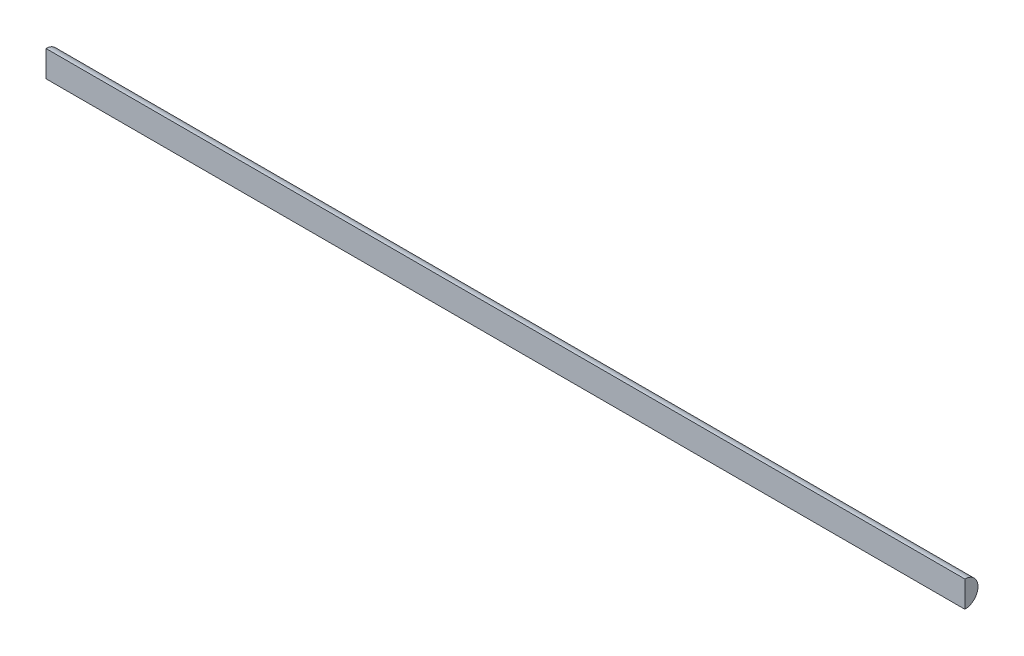
ISO-10303-21;
HEADER;
FILE_DESCRIPTION(('STEP AP214'),'2;1');
FILE_NAME('part.step','',(''),(''),'','','');
FILE_SCHEMA(('AUTOMOTIVE_DESIGN { 1 0 10303 214 1 1 1 1 }'));
ENDSEC;
DATA;
#1=APPLICATION_CONTEXT('core data for automotive mechanical design processes');
#2=APPLICATION_PROTOCOL_DEFINITION('international standard','automotive_design',2000,#1);
#3=PRODUCT_CONTEXT('',#1,'mechanical');
#4=PRODUCT('Part','Part','',(#3));
#5=PRODUCT_RELATED_PRODUCT_CATEGORY('part','',(#4));
#6=PRODUCT_DEFINITION_FORMATION('','',#4);
#7=PRODUCT_DEFINITION_CONTEXT('part definition',#1,'design');
#8=PRODUCT_DEFINITION('design','',#6,#7);
#9=PRODUCT_DEFINITION_SHAPE('','',#8);
#10=(LENGTH_UNIT() NAMED_UNIT(*) SI_UNIT(.MILLI.,.METRE.));
#11=(NAMED_UNIT(*) PLANE_ANGLE_UNIT() SI_UNIT($,.RADIAN.));
#12=(NAMED_UNIT(*) SI_UNIT($,.STERADIAN.) SOLID_ANGLE_UNIT());
#13=UNCERTAINTY_MEASURE_WITH_UNIT(LENGTH_MEASURE(1.E-05),#10,'distance_accuracy_value','');
#14=(GEOMETRIC_REPRESENTATION_CONTEXT(3) GLOBAL_UNCERTAINTY_ASSIGNED_CONTEXT((#13)) GLOBAL_UNIT_ASSIGNED_CONTEXT((#10,
#11,#12)) REPRESENTATION_CONTEXT('',''));
#15=CARTESIAN_POINT('',(0.,0.,0.));
#16=DIRECTION('',(0.,0.,1.));
#17=DIRECTION('',(1.,0.,0.));
#18=AXIS2_PLACEMENT_3D('',#15,#16,#17);
#19=CARTESIAN_POINT('',(35.,0.,0.));
#20=DIRECTION('',(-1.,0.,0.));
#21=DIRECTION('',(0.,0.,1.));
#22=AXIS2_PLACEMENT_3D('',#19,#20,#21);
#23=CYLINDRICAL_SURFACE('',#22,0.5);
#24=CARTESIAN_POINT('',(0.,0.,0.));
#25=DIRECTION('',(1.,0.,0.));
#26=DIRECTION('',(0.,0.,-1.));
#27=AXIS2_PLACEMENT_3D('',#24,#25,#26);
#28=CIRCLE('',#27,0.5);
#29=CARTESIAN_POINT('',(0.,-0.5,0.));
#30=VERTEX_POINT('',#29);
#31=CARTESIAN_POINT('',(0.,0.5,0.));
#32=VERTEX_POINT('',#31);
#33=EDGE_CURVE('E66',#30,#32,#28,.T.);
#34=ORIENTED_EDGE('',*,*,#33,.T.);
#35=DIRECTION('',(-1.,0.,0.));
#36=VECTOR('',#35,1.);
#37=CARTESIAN_POINT('',(35.,0.5,0.));
#38=LINE('',#37,#36);
#39=CARTESIAN_POINT('',(35.,0.5,0.));
#40=VERTEX_POINT('',#39);
#41=EDGE_CURVE('E11',#40,#32,#38,.T.);
#42=ORIENTED_EDGE('',*,*,#41,.F.);
#43=CARTESIAN_POINT('',(35.,0.,0.));
#44=DIRECTION('',(1.,0.,0.));
#45=DIRECTION('',(0.,0.,-1.));
#46=AXIS2_PLACEMENT_3D('',#43,#44,#45);
#47=CIRCLE('',#46,0.5);
#48=CARTESIAN_POINT('',(35.,-0.5,0.));
#49=VERTEX_POINT('',#48);
#50=EDGE_CURVE('E65',#49,#40,#47,.T.);
#51=ORIENTED_EDGE('',*,*,#50,.F.);
#52=DIRECTION('',(-1.,0.,0.));
#53=VECTOR('',#52,1.);
#54=CARTESIAN_POINT('',(35.,-0.5,0.));
#55=LINE('',#54,#53);
#56=EDGE_CURVE('E43',#49,#30,#55,.T.);
#57=ORIENTED_EDGE('',*,*,#56,.T.);
#58=EDGE_LOOP('',(#34,#42,#51,#57));
#59=FACE_BOUND('',#58,.T.);
#60=ADVANCED_FACE('F35',(#59),#23,.T.);
#61=CARTESIAN_POINT('',(35.,0.5,0.));
#62=DIRECTION('',(0.,0.,-1.));
#63=DIRECTION('',(-1.,0.,0.));
#64=AXIS2_PLACEMENT_3D('',#61,#62,#63);
#65=PLANE('',#64);
#66=DIRECTION('',(0.,-1.,0.));
#67=VECTOR('',#66,1.);
#68=CARTESIAN_POINT('',(0.,0.5,0.));
#69=LINE('',#68,#67);
#70=EDGE_CURVE('E58',#32,#30,#69,.T.);
#71=ORIENTED_EDGE('',*,*,#70,.T.);
#72=ORIENTED_EDGE('',*,*,#56,.F.);
#73=DIRECTION('',(0.,-1.,0.));
#74=VECTOR('',#73,1.);
#75=CARTESIAN_POINT('',(35.,0.5,0.));
#76=LINE('',#75,#74);
#77=EDGE_CURVE('E50',#40,#49,#76,.T.);
#78=ORIENTED_EDGE('',*,*,#77,.F.);
#79=ORIENTED_EDGE('',*,*,#41,.T.);
#80=EDGE_LOOP('',(#71,#72,#78,#79));
#81=FACE_BOUND('',#80,.T.);
#82=ADVANCED_FACE('F61',(#81),#65,.F.);
#83=CARTESIAN_POINT('',(35.,0.,0.));
#84=DIRECTION('',(1.,0.,0.));
#85=DIRECTION('',(0.,0.,-1.));
#86=AXIS2_PLACEMENT_3D('',#83,#84,#85);
#87=PLANE('',#86);
#88=ORIENTED_EDGE('',*,*,#50,.T.);
#89=ORIENTED_EDGE('',*,*,#77,.T.);
#90=EDGE_LOOP('',(#88,#89));
#91=FACE_BOUND('',#90,.T.);
#92=ADVANCED_FACE('F73',(#91),#87,.T.);
#93=CARTESIAN_POINT('',(0.,0.,0.));
#94=DIRECTION('',(1.,0.,0.));
#95=DIRECTION('',(0.,0.,-1.));
#96=AXIS2_PLACEMENT_3D('',#93,#94,#95);
#97=PLANE('',#96);
#98=ORIENTED_EDGE('',*,*,#33,.F.);
#99=ORIENTED_EDGE('',*,*,#70,.F.);
#100=EDGE_LOOP('',(#98,#99));
#101=FACE_BOUND('',#100,.T.);
#102=ADVANCED_FACE('F69',(#101),#97,.F.);
#103=CLOSED_SHELL('',(#60,#82,#92,#102));
#104=MANIFOLD_SOLID_BREP('B2',#103);
#105=ADVANCED_BREP_SHAPE_REPRESENTATION('',(#18,#104),#14);
#106=SHAPE_DEFINITION_REPRESENTATION(#9,#105);
ENDSEC;
END-ISO-10303-21;
